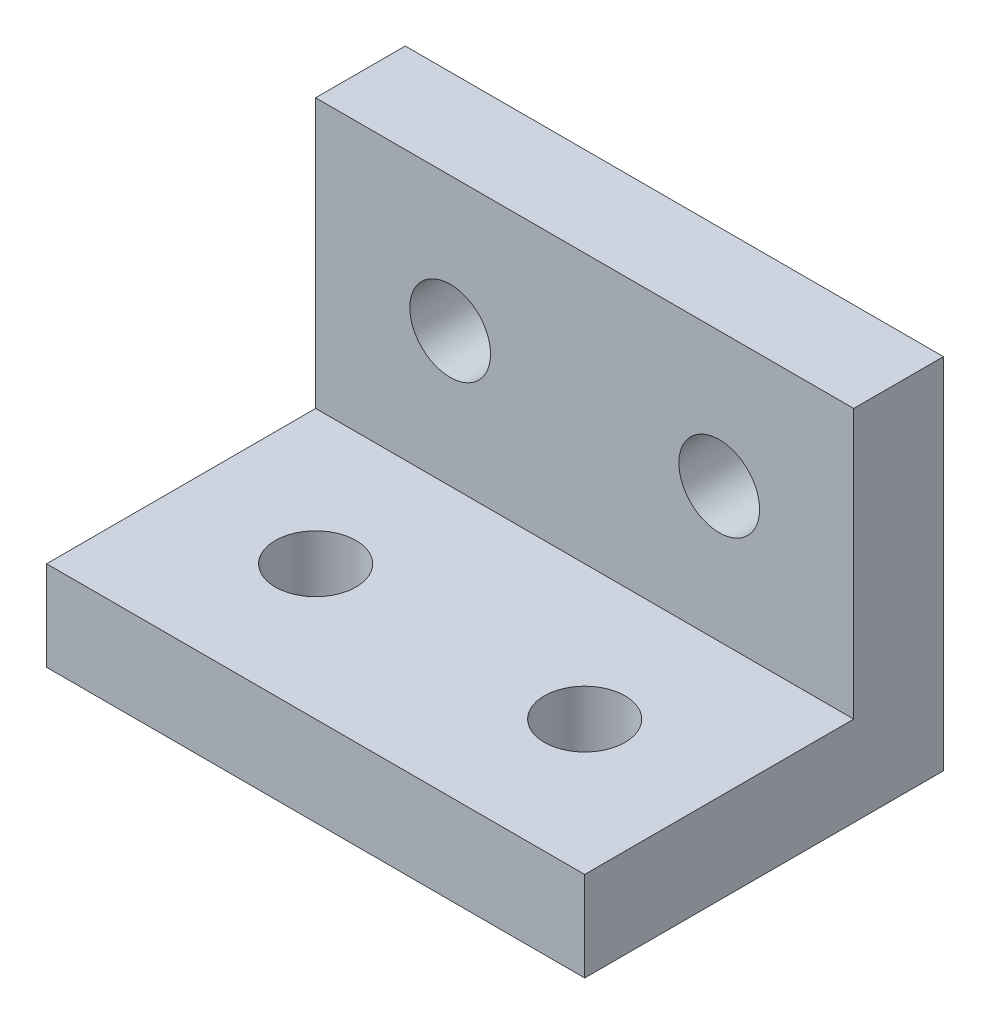
ISO-10303-21;
HEADER;
FILE_DESCRIPTION(('STEP AP214'),'2;1');
FILE_NAME('part.step','',(''),(''),'','','');
FILE_SCHEMA(('AUTOMOTIVE_DESIGN { 1 0 10303 214 1 1 1 1 }'));
ENDSEC;
DATA;
#1=APPLICATION_CONTEXT('core data for automotive mechanical design processes');
#2=APPLICATION_PROTOCOL_DEFINITION('international standard','automotive_design',2000,#1);
#3=PRODUCT_CONTEXT('',#1,'mechanical');
#4=PRODUCT('Part','Part','',(#3));
#5=PRODUCT_RELATED_PRODUCT_CATEGORY('part','',(#4));
#6=PRODUCT_DEFINITION_FORMATION('','',#4);
#7=PRODUCT_DEFINITION_CONTEXT('part definition',#1,'design');
#8=PRODUCT_DEFINITION('design','',#6,#7);
#9=PRODUCT_DEFINITION_SHAPE('','',#8);
#10=(LENGTH_UNIT() NAMED_UNIT(*) SI_UNIT(.MILLI.,.METRE.));
#11=(NAMED_UNIT(*) PLANE_ANGLE_UNIT() SI_UNIT($,.RADIAN.));
#12=(NAMED_UNIT(*) SI_UNIT($,.STERADIAN.) SOLID_ANGLE_UNIT());
#13=UNCERTAINTY_MEASURE_WITH_UNIT(LENGTH_MEASURE(1.E-05),#10,'distance_accuracy_value','');
#14=(GEOMETRIC_REPRESENTATION_CONTEXT(3) GLOBAL_UNCERTAINTY_ASSIGNED_CONTEXT((#13)) GLOBAL_UNIT_ASSIGNED_CONTEXT((#10,
#11,#12)) REPRESENTATION_CONTEXT('',''));
#15=CARTESIAN_POINT('',(0.,0.,0.));
#16=DIRECTION('',(0.,0.,1.));
#17=DIRECTION('',(1.,0.,0.));
#18=AXIS2_PLACEMENT_3D('',#15,#16,#17);
#19=CARTESIAN_POINT('',(30.,0.,0.));
#20=DIRECTION('',(0.,1.,0.));
#21=DIRECTION('',(0.,0.,1.));
#22=AXIS2_PLACEMENT_3D('',#19,#20,#21);
#23=PLANE('',#22);
#24=CARTESIAN_POINT('',(7.5,0.,12.5));
#25=DIRECTION('',(0.,1.,0.));
#26=DIRECTION('',(0.,0.,1.));
#27=AXIS2_PLACEMENT_3D('',#24,#25,#26);
#28=CIRCLE('',#27,2.25);
#29=CARTESIAN_POINT('',(7.5,0.,14.75));
#30=VERTEX_POINT('',#29);
#31=EDGE_CURVE('E163',#30,#30,#28,.T.);
#32=ORIENTED_EDGE('',*,*,#31,.T.);
#33=EDGE_LOOP('',(#32));
#34=FACE_BOUND('',#33,.T.);
#35=CARTESIAN_POINT('',(22.5,0.,12.5));
#36=DIRECTION('',(0.,1.,0.));
#37=DIRECTION('',(0.,0.,1.));
#38=AXIS2_PLACEMENT_3D('',#35,#36,#37);
#39=CIRCLE('',#38,2.25);
#40=CARTESIAN_POINT('',(22.5,0.,14.75));
#41=VERTEX_POINT('',#40);
#42=EDGE_CURVE('E166',#41,#41,#39,.T.);
#43=ORIENTED_EDGE('',*,*,#42,.T.);
#44=EDGE_LOOP('',(#43));
#45=FACE_BOUND('',#44,.T.);
#46=DIRECTION('',(0.,0.,-1.));
#47=VECTOR('',#46,1.);
#48=CARTESIAN_POINT('',(0.,0.,0.));
#49=LINE('',#48,#47);
#50=CARTESIAN_POINT('',(0.,0.,20.));
#51=VERTEX_POINT('',#50);
#52=CARTESIAN_POINT('',(0.,0.,0.));
#53=VERTEX_POINT('',#52);
#54=EDGE_CURVE('E118',#51,#53,#49,.T.);
#55=ORIENTED_EDGE('',*,*,#54,.T.);
#56=DIRECTION('',(-1.,0.,0.));
#57=VECTOR('',#56,1.);
#58=CARTESIAN_POINT('',(30.,0.,0.));
#59=LINE('',#58,#57);
#60=CARTESIAN_POINT('',(30.,0.,0.));
#61=VERTEX_POINT('',#60);
#62=EDGE_CURVE('E11',#61,#53,#59,.T.);
#63=ORIENTED_EDGE('',*,*,#62,.F.);
#64=DIRECTION('',(0.,0.,-1.));
#65=VECTOR('',#64,1.);
#66=CARTESIAN_POINT('',(30.,0.,0.));
#67=LINE('',#66,#65);
#68=CARTESIAN_POINT('',(30.,0.,20.));
#69=VERTEX_POINT('',#68);
#70=EDGE_CURVE('E129',#69,#61,#67,.T.);
#71=ORIENTED_EDGE('',*,*,#70,.F.);
#72=DIRECTION('',(-1.,0.,0.));
#73=VECTOR('',#72,1.);
#74=CARTESIAN_POINT('',(30.,0.,20.));
#75=LINE('',#74,#73);
#76=EDGE_CURVE('E114',#69,#51,#75,.T.);
#77=ORIENTED_EDGE('',*,*,#76,.T.);
#78=EDGE_LOOP('',(#55,#63,#71,#77));
#79=FACE_BOUND('',#78,.T.);
#80=ADVANCED_FACE('F34',(#34,#45,#79),#23,.F.);
#81=CARTESIAN_POINT('',(30.,0.,0.));
#82=DIRECTION('',(0.,0.,1.));
#83=DIRECTION('',(1.,0.,0.));
#84=AXIS2_PLACEMENT_3D('',#81,#82,#83);
#85=PLANE('',#84);
#86=CARTESIAN_POINT('',(7.5,12.5,0.));
#87=DIRECTION('',(0.,0.,1.));
#88=DIRECTION('',(1.,0.,0.));
#89=AXIS2_PLACEMENT_3D('',#86,#87,#88);
#90=CIRCLE('',#89,2.25);
#91=CARTESIAN_POINT('',(9.75,12.5,0.));
#92=VERTEX_POINT('',#91);
#93=EDGE_CURVE('E122',#92,#92,#90,.T.);
#94=ORIENTED_EDGE('',*,*,#93,.T.);
#95=EDGE_LOOP('',(#94));
#96=FACE_BOUND('',#95,.T.);
#97=CARTESIAN_POINT('',(22.5,12.5,0.));
#98=DIRECTION('',(0.,0.,1.));
#99=DIRECTION('',(1.,0.,0.));
#100=AXIS2_PLACEMENT_3D('',#97,#98,#99);
#101=CIRCLE('',#100,2.25);
#102=CARTESIAN_POINT('',(24.75,12.5,0.));
#103=VERTEX_POINT('',#102);
#104=EDGE_CURVE('E182',#103,#103,#101,.T.);
#105=ORIENTED_EDGE('',*,*,#104,.T.);
#106=EDGE_LOOP('',(#105));
#107=FACE_BOUND('',#106,.T.);
#108=DIRECTION('',(0.,1.,0.));
#109=VECTOR('',#108,1.);
#110=CARTESIAN_POINT('',(0.,0.,0.));
#111=LINE('',#110,#109);
#112=CARTESIAN_POINT('',(0.,20.,0.));
#113=VERTEX_POINT('',#112);
#114=EDGE_CURVE('E121',#53,#113,#111,.T.);
#115=ORIENTED_EDGE('',*,*,#114,.T.);
#116=DIRECTION('',(-1.,0.,0.));
#117=VECTOR('',#116,1.);
#118=CARTESIAN_POINT('',(30.,20.,0.));
#119=LINE('',#118,#117);
#120=CARTESIAN_POINT('',(30.,20.,0.));
#121=VERTEX_POINT('',#120);
#122=EDGE_CURVE('E42',#121,#113,#119,.T.);
#123=ORIENTED_EDGE('',*,*,#122,.F.);
#124=DIRECTION('',(0.,1.,0.));
#125=VECTOR('',#124,1.);
#126=CARTESIAN_POINT('',(30.,0.,0.));
#127=LINE('',#126,#125);
#128=EDGE_CURVE('E87',#61,#121,#127,.T.);
#129=ORIENTED_EDGE('',*,*,#128,.F.);
#130=ORIENTED_EDGE('',*,*,#62,.T.);
#131=EDGE_LOOP('',(#115,#123,#129,#130));
#132=FACE_BOUND('',#131,.T.);
#133=ADVANCED_FACE('F154',(#96,#107,#132),#85,.F.);
#134=CARTESIAN_POINT('',(30.,20.,5.));
#135=DIRECTION('',(0.,-1.,0.));
#136=DIRECTION('',(0.,0.,-1.));
#137=AXIS2_PLACEMENT_3D('',#134,#135,#136);
#138=PLANE('',#137);
#139=DIRECTION('',(0.,0.,1.));
#140=VECTOR('',#139,1.);
#141=CARTESIAN_POINT('',(0.,20.,5.));
#142=LINE('',#141,#140);
#143=CARTESIAN_POINT('',(0.,20.,5.));
#144=VERTEX_POINT('',#143);
#145=EDGE_CURVE('E124',#113,#144,#142,.T.);
#146=ORIENTED_EDGE('',*,*,#145,.T.);
#147=DIRECTION('',(-1.,0.,0.));
#148=VECTOR('',#147,1.);
#149=CARTESIAN_POINT('',(30.,20.,5.));
#150=LINE('',#149,#148);
#151=CARTESIAN_POINT('',(30.,20.,5.));
#152=VERTEX_POINT('',#151);
#153=EDGE_CURVE('E109',#152,#144,#150,.T.);
#154=ORIENTED_EDGE('',*,*,#153,.F.);
#155=DIRECTION('',(0.,0.,1.));
#156=VECTOR('',#155,1.);
#157=CARTESIAN_POINT('',(30.,20.,5.));
#158=LINE('',#157,#156);
#159=EDGE_CURVE('E100',#121,#152,#158,.T.);
#160=ORIENTED_EDGE('',*,*,#159,.F.);
#161=ORIENTED_EDGE('',*,*,#122,.T.);
#162=EDGE_LOOP('',(#146,#154,#160,#161));
#163=FACE_BOUND('',#162,.T.);
#164=ADVANCED_FACE('F135',(#163),#138,.F.);
#165=CARTESIAN_POINT('',(30.,5.,5.));
#166=DIRECTION('',(0.,0.,-1.));
#167=DIRECTION('',(0.,1.,0.));
#168=AXIS2_PLACEMENT_3D('',#165,#166,#167);
#169=PLANE('',#168);
#170=CARTESIAN_POINT('',(7.5,12.5,5.));
#171=DIRECTION('',(0.,0.,1.));
#172=DIRECTION('',(1.,0.,0.));
#173=AXIS2_PLACEMENT_3D('',#170,#171,#172);
#174=CIRCLE('',#173,2.25);
#175=CARTESIAN_POINT('',(9.75,12.5,5.));
#176=VERTEX_POINT('',#175);
#177=EDGE_CURVE('E179',#176,#176,#174,.T.);
#178=ORIENTED_EDGE('',*,*,#177,.F.);
#179=EDGE_LOOP('',(#178));
#180=FACE_BOUND('',#179,.T.);
#181=CARTESIAN_POINT('',(22.5,12.5,5.));
#182=DIRECTION('',(0.,0.,1.));
#183=DIRECTION('',(1.,0.,0.));
#184=AXIS2_PLACEMENT_3D('',#181,#182,#183);
#185=CIRCLE('',#184,2.25);
#186=CARTESIAN_POINT('',(24.75,12.5,5.));
#187=VERTEX_POINT('',#186);
#188=EDGE_CURVE('E185',#187,#187,#185,.T.);
#189=ORIENTED_EDGE('',*,*,#188,.F.);
#190=EDGE_LOOP('',(#189));
#191=FACE_BOUND('',#190,.T.);
#192=DIRECTION('',(0.,-1.,0.));
#193=VECTOR('',#192,1.);
#194=CARTESIAN_POINT('',(0.,5.,5.));
#195=LINE('',#194,#193);
#196=CARTESIAN_POINT('',(0.,5.,5.));
#197=VERTEX_POINT('',#196);
#198=EDGE_CURVE('E108',#144,#197,#195,.T.);
#199=ORIENTED_EDGE('',*,*,#198,.T.);
#200=DIRECTION('',(-1.,0.,0.));
#201=VECTOR('',#200,1.);
#202=CARTESIAN_POINT('',(30.,5.,5.));
#203=LINE('',#202,#201);
#204=CARTESIAN_POINT('',(30.,5.,5.));
#205=VERTEX_POINT('',#204);
#206=EDGE_CURVE('E105',#205,#197,#203,.T.);
#207=ORIENTED_EDGE('',*,*,#206,.F.);
#208=DIRECTION('',(0.,-1.,0.));
#209=VECTOR('',#208,1.);
#210=CARTESIAN_POINT('',(30.,5.,5.));
#211=LINE('',#210,#209);
#212=EDGE_CURVE('E94',#152,#205,#211,.T.);
#213=ORIENTED_EDGE('',*,*,#212,.F.);
#214=ORIENTED_EDGE('',*,*,#153,.T.);
#215=EDGE_LOOP('',(#199,#207,#213,#214));
#216=FACE_BOUND('',#215,.T.);
#217=ADVANCED_FACE('F106',(#180,#191,#216),#169,.F.);
#218=CARTESIAN_POINT('',(30.,5.,20.));
#219=DIRECTION('',(0.,-1.,0.));
#220=DIRECTION('',(0.,0.,-1.));
#221=AXIS2_PLACEMENT_3D('',#218,#219,#220);
#222=PLANE('',#221);
#223=CARTESIAN_POINT('',(7.5,5.,12.5));
#224=DIRECTION('',(0.,1.,0.));
#225=DIRECTION('',(0.,0.,1.));
#226=AXIS2_PLACEMENT_3D('',#223,#224,#225);
#227=CIRCLE('',#226,2.25);
#228=CARTESIAN_POINT('',(7.5,5.,14.75));
#229=VERTEX_POINT('',#228);
#230=EDGE_CURVE('E168',#229,#229,#227,.T.);
#231=ORIENTED_EDGE('',*,*,#230,.F.);
#232=EDGE_LOOP('',(#231));
#233=FACE_BOUND('',#232,.T.);
#234=CARTESIAN_POINT('',(22.5,5.,12.5));
#235=DIRECTION('',(0.,1.,0.));
#236=DIRECTION('',(0.,0.,1.));
#237=AXIS2_PLACEMENT_3D('',#234,#235,#236);
#238=CIRCLE('',#237,2.25);
#239=CARTESIAN_POINT('',(22.5,5.,14.75));
#240=VERTEX_POINT('',#239);
#241=EDGE_CURVE('E169',#240,#240,#238,.T.);
#242=ORIENTED_EDGE('',*,*,#241,.F.);
#243=EDGE_LOOP('',(#242));
#244=FACE_BOUND('',#243,.T.);
#245=DIRECTION('',(0.,0.,1.));
#246=VECTOR('',#245,1.);
#247=CARTESIAN_POINT('',(0.,5.,20.));
#248=LINE('',#247,#246);
#249=CARTESIAN_POINT('',(0.,5.,20.));
#250=VERTEX_POINT('',#249);
#251=EDGE_CURVE('E73',#197,#250,#248,.T.);
#252=ORIENTED_EDGE('',*,*,#251,.T.);
#253=DIRECTION('',(-1.,0.,0.));
#254=VECTOR('',#253,1.);
#255=CARTESIAN_POINT('',(30.,5.,20.));
#256=LINE('',#255,#254);
#257=CARTESIAN_POINT('',(30.,5.,20.));
#258=VERTEX_POINT('',#257);
#259=EDGE_CURVE('E110',#258,#250,#256,.T.);
#260=ORIENTED_EDGE('',*,*,#259,.F.);
#261=DIRECTION('',(0.,0.,1.));
#262=VECTOR('',#261,1.);
#263=CARTESIAN_POINT('',(30.,5.,20.));
#264=LINE('',#263,#262);
#265=EDGE_CURVE('E98',#205,#258,#264,.T.);
#266=ORIENTED_EDGE('',*,*,#265,.F.);
#267=ORIENTED_EDGE('',*,*,#206,.T.);
#268=EDGE_LOOP('',(#252,#260,#266,#267));
#269=FACE_BOUND('',#268,.T.);
#270=ADVANCED_FACE('F112',(#233,#244,#269),#222,.F.);
#271=CARTESIAN_POINT('',(30.,0.,20.));
#272=DIRECTION('',(0.,0.,-1.));
#273=DIRECTION('',(0.,1.,0.));
#274=AXIS2_PLACEMENT_3D('',#271,#272,#273);
#275=PLANE('',#274);
#276=DIRECTION('',(0.,-1.,0.));
#277=VECTOR('',#276,1.);
#278=CARTESIAN_POINT('',(0.,0.,20.));
#279=LINE('',#278,#277);
#280=EDGE_CURVE('E79',#250,#51,#279,.T.);
#281=ORIENTED_EDGE('',*,*,#280,.T.);
#282=ORIENTED_EDGE('',*,*,#76,.F.);
#283=DIRECTION('',(0.,-1.,0.));
#284=VECTOR('',#283,1.);
#285=CARTESIAN_POINT('',(30.,0.,20.));
#286=LINE('',#285,#284);
#287=EDGE_CURVE('E50',#258,#69,#286,.T.);
#288=ORIENTED_EDGE('',*,*,#287,.F.);
#289=ORIENTED_EDGE('',*,*,#259,.T.);
#290=EDGE_LOOP('',(#281,#282,#288,#289));
#291=FACE_BOUND('',#290,.T.);
#292=ADVANCED_FACE('F142',(#291),#275,.F.);
#293=CARTESIAN_POINT('',(30.,0.,0.));
#294=DIRECTION('',(-1.,0.,0.));
#295=DIRECTION('',(0.,0.,1.));
#296=AXIS2_PLACEMENT_3D('',#293,#294,#295);
#297=PLANE('',#296);
#298=ORIENTED_EDGE('',*,*,#70,.T.);
#299=ORIENTED_EDGE('',*,*,#128,.T.);
#300=ORIENTED_EDGE('',*,*,#159,.T.);
#301=ORIENTED_EDGE('',*,*,#212,.T.);
#302=ORIENTED_EDGE('',*,*,#265,.T.);
#303=ORIENTED_EDGE('',*,*,#287,.T.);
#304=EDGE_LOOP('',(#298,#299,#300,#301,#302,#303));
#305=FACE_BOUND('',#304,.T.);
#306=ADVANCED_FACE('F96',(#305),#297,.F.);
#307=CARTESIAN_POINT('',(0.,0.,0.));
#308=DIRECTION('',(-1.,0.,0.));
#309=DIRECTION('',(0.,0.,1.));
#310=AXIS2_PLACEMENT_3D('',#307,#308,#309);
#311=PLANE('',#310);
#312=ORIENTED_EDGE('',*,*,#54,.F.);
#313=ORIENTED_EDGE('',*,*,#280,.F.);
#314=ORIENTED_EDGE('',*,*,#251,.F.);
#315=ORIENTED_EDGE('',*,*,#198,.F.);
#316=ORIENTED_EDGE('',*,*,#145,.F.);
#317=ORIENTED_EDGE('',*,*,#114,.F.);
#318=EDGE_LOOP('',(#312,#313,#314,#315,#316,#317));
#319=FACE_BOUND('',#318,.T.);
#320=ADVANCED_FACE('F138',(#319),#311,.T.);
#321=CARTESIAN_POINT('',(22.5,12.5,0.));
#322=DIRECTION('',(0.,0.,1.));
#323=DIRECTION('',(1.,0.,0.));
#324=AXIS2_PLACEMENT_3D('',#321,#322,#323);
#325=CYLINDRICAL_SURFACE('',#324,2.25);
#326=ORIENTED_EDGE('',*,*,#104,.F.);
#327=EDGE_LOOP('',(#326));
#328=FACE_BOUND('',#327,.T.);
#329=ORIENTED_EDGE('',*,*,#188,.T.);
#330=EDGE_LOOP('',(#329));
#331=FACE_BOUND('',#330,.T.);
#332=ADVANCED_FACE('F191',(#328,#331),#325,.F.);
#333=CARTESIAN_POINT('',(7.5,12.5,0.));
#334=DIRECTION('',(0.,0.,1.));
#335=DIRECTION('',(1.,0.,0.));
#336=AXIS2_PLACEMENT_3D('',#333,#334,#335);
#337=CYLINDRICAL_SURFACE('',#336,2.25);
#338=ORIENTED_EDGE('',*,*,#93,.F.);
#339=EDGE_LOOP('',(#338));
#340=FACE_BOUND('',#339,.T.);
#341=ORIENTED_EDGE('',*,*,#177,.T.);
#342=EDGE_LOOP('',(#341));
#343=FACE_BOUND('',#342,.T.);
#344=ADVANCED_FACE('F202',(#340,#343),#337,.F.);
#345=CARTESIAN_POINT('',(22.5,0.,12.5));
#346=DIRECTION('',(0.,1.,0.));
#347=DIRECTION('',(0.,0.,1.));
#348=AXIS2_PLACEMENT_3D('',#345,#346,#347);
#349=CYLINDRICAL_SURFACE('',#348,2.25);
#350=ORIENTED_EDGE('',*,*,#42,.F.);
#351=EDGE_LOOP('',(#350));
#352=FACE_BOUND('',#351,.T.);
#353=ORIENTED_EDGE('',*,*,#241,.T.);
#354=EDGE_LOOP('',(#353));
#355=FACE_BOUND('',#354,.T.);
#356=ADVANCED_FACE('F204',(#352,#355),#349,.F.);
#357=CARTESIAN_POINT('',(7.5,0.,12.5));
#358=DIRECTION('',(0.,1.,0.));
#359=DIRECTION('',(0.,0.,1.));
#360=AXIS2_PLACEMENT_3D('',#357,#358,#359);
#361=CYLINDRICAL_SURFACE('',#360,2.25);
#362=ORIENTED_EDGE('',*,*,#31,.F.);
#363=EDGE_LOOP('',(#362));
#364=FACE_BOUND('',#363,.T.);
#365=ORIENTED_EDGE('',*,*,#230,.T.);
#366=EDGE_LOOP('',(#365));
#367=FACE_BOUND('',#366,.T.);
#368=ADVANCED_FACE('F211',(#364,#367),#361,.F.);
#369=CLOSED_SHELL('',(#80,#133,#164,#217,#270,#292,#306,#320,#332,#344,#356,#368));
#370=MANIFOLD_SOLID_BREP('B2',#369);
#371=ADVANCED_BREP_SHAPE_REPRESENTATION('',(#18,#370),#14);
#372=SHAPE_DEFINITION_REPRESENTATION(#9,#371);
ENDSEC;
END-ISO-10303-21;
